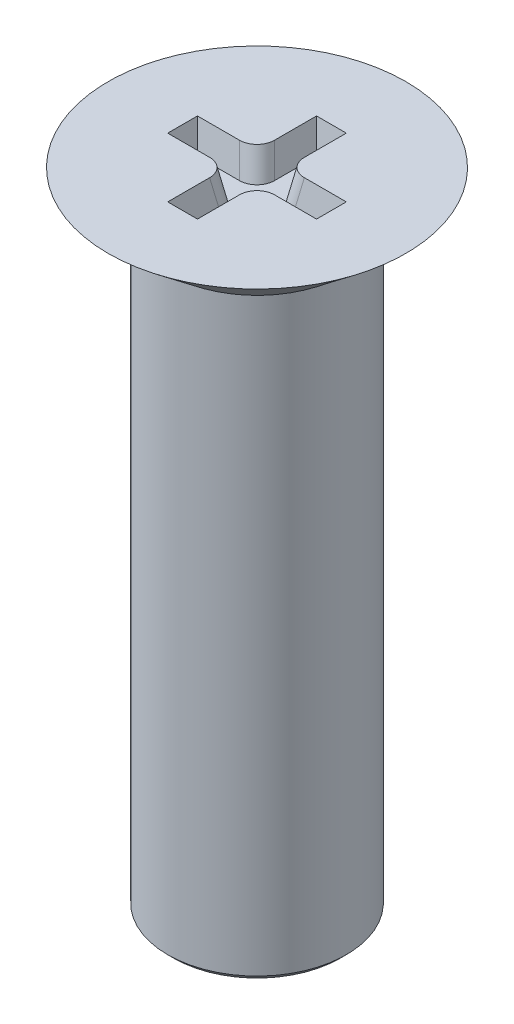
ISO-10303-21;
HEADER;
FILE_DESCRIPTION(('STEP AP214'),'2;1');
FILE_NAME('part.step','',(''),(''),'','','');
FILE_SCHEMA(('AUTOMOTIVE_DESIGN { 1 0 10303 214 1 1 1 1 }'));
ENDSEC;
DATA;
#1=APPLICATION_CONTEXT('core data for automotive mechanical design processes');
#2=APPLICATION_PROTOCOL_DEFINITION('international standard','automotive_design',2000,#1);
#3=PRODUCT_CONTEXT('',#1,'mechanical');
#4=PRODUCT('Part','Part','',(#3));
#5=PRODUCT_RELATED_PRODUCT_CATEGORY('part','',(#4));
#6=PRODUCT_DEFINITION_FORMATION('','',#4);
#7=PRODUCT_DEFINITION_CONTEXT('part definition',#1,'design');
#8=PRODUCT_DEFINITION('design','',#6,#7);
#9=PRODUCT_DEFINITION_SHAPE('','',#8);
#10=(LENGTH_UNIT() NAMED_UNIT(*) SI_UNIT(.MILLI.,.METRE.));
#11=(NAMED_UNIT(*) PLANE_ANGLE_UNIT() SI_UNIT($,.RADIAN.));
#12=(NAMED_UNIT(*) SI_UNIT($,.STERADIAN.) SOLID_ANGLE_UNIT());
#13=UNCERTAINTY_MEASURE_WITH_UNIT(LENGTH_MEASURE(1.E-05),#10,'distance_accuracy_value','');
#14=(GEOMETRIC_REPRESENTATION_CONTEXT(3) GLOBAL_UNCERTAINTY_ASSIGNED_CONTEXT((#13)) GLOBAL_UNIT_ASSIGNED_CONTEXT((#10,
#11,#12)) REPRESENTATION_CONTEXT('',''));
#15=CARTESIAN_POINT('',(0.,0.,0.));
#16=DIRECTION('',(0.,0.,1.));
#17=DIRECTION('',(1.,0.,0.));
#18=AXIS2_PLACEMENT_3D('',#15,#16,#17);
#19=CARTESIAN_POINT('',(0.,0.,0.));
#20=DIRECTION('',(0.,1.,0.));
#21=DIRECTION('',(0.,0.,1.));
#22=AXIS2_PLACEMENT_3D('',#19,#20,#21);
#23=PLANE('',#22);
#24=CARTESIAN_POINT('',(0.,0.,0.));
#25=DIRECTION('',(0.,-1.,0.));
#26=DIRECTION('',(0.,0.,-1.));
#27=AXIS2_PLACEMENT_3D('',#24,#25,#26);
#28=CIRCLE('',#27,2.5);
#29=CARTESIAN_POINT('',(0.,0.,-2.5));
#30=VERTEX_POINT('',#29);
#31=EDGE_CURVE('E254',#30,#30,#28,.T.);
#32=ORIENTED_EDGE('',*,*,#31,.F.);
#33=EDGE_LOOP('',(#32));
#34=FACE_BOUND('',#33,.T.);
#35=DIRECTION('',(1.,0.,0.));
#36=VECTOR('',#35,1.);
#37=CARTESIAN_POINT('',(0.,0.,-0.25));
#38=LINE('',#37,#36);
#39=CARTESIAN_POINT('',(-1.25,0.,-0.25));
#40=VERTEX_POINT('',#39);
#41=CARTESIAN_POINT('',(-0.545442325903662,0.,-0.25));
#42=VERTEX_POINT('',#41);
#43=EDGE_CURVE('E184',#40,#42,#38,.T.);
#44=ORIENTED_EDGE('',*,*,#43,.T.);
#45=CARTESIAN_POINT('',(-0.554627983565723,0.,-0.554627983565723));
#46=DIRECTION('',(0.,1.,0.));
#47=DIRECTION('',(-0.707106781186548,0.,-0.707106781186547));
#48=AXIS2_PLACEMENT_3D('',#45,#46,#47);
#49=ELLIPSE('',#48,0.309186702079241,0.3);
#50=CARTESIAN_POINT('',(-0.25,0.,-0.545442325903662));
#51=VERTEX_POINT('',#50);
#52=EDGE_CURVE('E272',#42,#51,#49,.T.);
#53=ORIENTED_EDGE('',*,*,#52,.T.);
#54=DIRECTION('',(0.,0.,1.));
#55=VECTOR('',#54,1.);
#56=CARTESIAN_POINT('',(-0.25,0.,0.));
#57=LINE('',#56,#55);
#58=CARTESIAN_POINT('',(-0.25,0.,-1.25));
#59=VERTEX_POINT('',#58);
#60=EDGE_CURVE('E182',#59,#51,#57,.T.);
#61=ORIENTED_EDGE('',*,*,#60,.F.);
#62=DIRECTION('',(1.,0.,0.));
#63=VECTOR('',#62,1.);
#64=CARTESIAN_POINT('',(0.,0.,-1.25));
#65=LINE('',#64,#63);
#66=CARTESIAN_POINT('',(0.25,0.,-1.25));
#67=VERTEX_POINT('',#66);
#68=EDGE_CURVE('E161',#59,#67,#65,.T.);
#69=ORIENTED_EDGE('',*,*,#68,.T.);
#70=DIRECTION('',(0.,0.,1.));
#71=VECTOR('',#70,1.);
#72=CARTESIAN_POINT('',(0.25,0.,0.));
#73=LINE('',#72,#71);
#74=CARTESIAN_POINT('',(0.25,0.,-0.545442325903662));
#75=VERTEX_POINT('',#74);
#76=EDGE_CURVE('E173',#67,#75,#73,.T.);
#77=ORIENTED_EDGE('',*,*,#76,.T.);
#78=CARTESIAN_POINT('',(0.554627983565724,0.,-0.554627983565723));
#79=DIRECTION('',(0.,1.,0.));
#80=DIRECTION('',(0.707106781186547,0.,-0.707106781186548));
#81=AXIS2_PLACEMENT_3D('',#78,#79,#80);
#82=ELLIPSE('',#81,0.309186702079241,0.3);
#83=CARTESIAN_POINT('',(0.545442325903663,0.,-0.25));
#84=VERTEX_POINT('',#83);
#85=EDGE_CURVE('E270',#75,#84,#82,.T.);
#86=ORIENTED_EDGE('',*,*,#85,.T.);
#87=DIRECTION('',(1.,0.,0.));
#88=VECTOR('',#87,1.);
#89=CARTESIAN_POINT('',(0.,0.,-0.25));
#90=LINE('',#89,#88);
#91=CARTESIAN_POINT('',(1.25,0.,-0.25));
#92=VERTEX_POINT('',#91);
#93=EDGE_CURVE('E178',#84,#92,#90,.T.);
#94=ORIENTED_EDGE('',*,*,#93,.T.);
#95=DIRECTION('',(0.,0.,-1.));
#96=VECTOR('',#95,1.);
#97=CARTESIAN_POINT('',(1.25,0.,0.));
#98=LINE('',#97,#96);
#99=CARTESIAN_POINT('',(1.25,0.,0.25));
#100=VERTEX_POINT('',#99);
#101=EDGE_CURVE('E204',#100,#92,#98,.T.);
#102=ORIENTED_EDGE('',*,*,#101,.F.);
#103=DIRECTION('',(1.,0.,0.));
#104=VECTOR('',#103,1.);
#105=CARTESIAN_POINT('',(0.,0.,0.25));
#106=LINE('',#105,#104);
#107=CARTESIAN_POINT('',(0.545442325903663,0.,0.25));
#108=VERTEX_POINT('',#107);
#109=EDGE_CURVE('E202',#108,#100,#106,.T.);
#110=ORIENTED_EDGE('',*,*,#109,.F.);
#111=CARTESIAN_POINT('',(0.554627983565724,0.,0.554627983565724));
#112=DIRECTION('',(0.,1.,0.));
#113=DIRECTION('',(0.707106781186548,0.,0.707106781186547));
#114=AXIS2_PLACEMENT_3D('',#111,#112,#113);
#115=ELLIPSE('',#114,0.309186702079241,0.3);
#116=CARTESIAN_POINT('',(0.25,0.,0.545442325903663));
#117=VERTEX_POINT('',#116);
#118=EDGE_CURVE('E266',#108,#117,#115,.T.);
#119=ORIENTED_EDGE('',*,*,#118,.T.);
#120=DIRECTION('',(0.,0.,1.));
#121=VECTOR('',#120,1.);
#122=CARTESIAN_POINT('',(0.25,0.,0.));
#123=LINE('',#122,#121);
#124=CARTESIAN_POINT('',(0.250000000000001,0.,1.25));
#125=VERTEX_POINT('',#124);
#126=EDGE_CURVE('E200',#117,#125,#123,.T.);
#127=ORIENTED_EDGE('',*,*,#126,.T.);
#128=DIRECTION('',(1.,0.,0.));
#129=VECTOR('',#128,1.);
#130=CARTESIAN_POINT('',(0.,0.,1.25));
#131=LINE('',#130,#129);
#132=CARTESIAN_POINT('',(-0.249999999999999,0.,1.25));
#133=VERTEX_POINT('',#132);
#134=EDGE_CURVE('E197',#133,#125,#131,.T.);
#135=ORIENTED_EDGE('',*,*,#134,.F.);
#136=DIRECTION('',(0.,0.,1.));
#137=VECTOR('',#136,1.);
#138=CARTESIAN_POINT('',(-0.25,0.,0.));
#139=LINE('',#138,#137);
#140=CARTESIAN_POINT('',(-0.25,0.,0.545442325903662));
#141=VERTEX_POINT('',#140);
#142=EDGE_CURVE('E195',#141,#133,#139,.T.);
#143=ORIENTED_EDGE('',*,*,#142,.F.);
#144=CARTESIAN_POINT('',(-0.554627983565723,0.,0.554627983565724));
#145=DIRECTION('',(0.,1.,0.));
#146=DIRECTION('',(-0.707106781186547,0.,0.707106781186548));
#147=AXIS2_PLACEMENT_3D('',#144,#145,#146);
#148=ELLIPSE('',#147,0.309186702079241,0.3);
#149=CARTESIAN_POINT('',(-0.545442325903662,0.,0.25));
#150=VERTEX_POINT('',#149);
#151=EDGE_CURVE('E268',#141,#150,#148,.T.);
#152=ORIENTED_EDGE('',*,*,#151,.T.);
#153=DIRECTION('',(1.,0.,0.));
#154=VECTOR('',#153,1.);
#155=CARTESIAN_POINT('',(0.,0.,0.25));
#156=LINE('',#155,#154);
#157=CARTESIAN_POINT('',(-1.25,0.,0.25));
#158=VERTEX_POINT('',#157);
#159=EDGE_CURVE('E192',#158,#150,#156,.T.);
#160=ORIENTED_EDGE('',*,*,#159,.F.);
#161=DIRECTION('',(0.,0.,-1.));
#162=VECTOR('',#161,1.);
#163=CARTESIAN_POINT('',(-1.25,0.,0.));
#164=LINE('',#163,#162);
#165=EDGE_CURVE('E189',#158,#40,#164,.T.);
#166=ORIENTED_EDGE('',*,*,#165,.T.);
#167=EDGE_LOOP('',(#44,#53,#61,#69,#77,#86,#94,#102,#110,#119,#127,#135,#143,#152,#160,#166));
#168=FACE_BOUND('',#167,.T.);
#169=ADVANCED_FACE('F45',(#34,#168),#23,.T.);
#170=CARTESIAN_POINT('',(0.,-0.8,0.));
#171=DIRECTION('',(0.,1.,0.));
#172=DIRECTION('',(0.,0.,1.));
#173=AXIS2_PLACEMENT_3D('',#170,#171,#172);
#174=CONICAL_SURFACE('',#173,1.5,0.896055384571344);
#175=ORIENTED_EDGE('',*,*,#31,.T.);
#176=EDGE_LOOP('',(#175));
#177=FACE_BOUND('',#176,.T.);
#178=CARTESIAN_POINT('',(0.,-0.8,0.));
#179=DIRECTION('',(0.,-1.,0.));
#180=DIRECTION('',(0.,0.,-1.));
#181=AXIS2_PLACEMENT_3D('',#178,#179,#180);
#182=CIRCLE('',#181,1.5);
#183=CARTESIAN_POINT('',(0.,-0.8,-1.5));
#184=VERTEX_POINT('',#183);
#185=EDGE_CURVE('E210',#184,#184,#182,.T.);
#186=ORIENTED_EDGE('',*,*,#185,.F.);
#187=EDGE_LOOP('',(#186));
#188=FACE_BOUND('',#187,.T.);
#189=ADVANCED_FACE('F349',(#177,#188),#174,.T.);
#190=CARTESIAN_POINT('',(0.,-10.8,0.));
#191=DIRECTION('',(0.,1.,0.));
#192=DIRECTION('',(0.,0.,1.));
#193=AXIS2_PLACEMENT_3D('',#190,#191,#192);
#194=CYLINDRICAL_SURFACE('',#193,1.5);
#195=CARTESIAN_POINT('',(0.,-10.7,0.));
#196=DIRECTION('',(0.,-1.,0.));
#197=DIRECTION('',(0.,0.,-1.));
#198=AXIS2_PLACEMENT_3D('',#195,#196,#197);
#199=CIRCLE('',#198,1.5);
#200=CARTESIAN_POINT('',(0.,-10.7,-1.5));
#201=VERTEX_POINT('',#200);
#202=EDGE_CURVE('E260',#201,#201,#199,.F.);
#203=ORIENTED_EDGE('',*,*,#202,.T.);
#204=EDGE_LOOP('',(#203));
#205=FACE_BOUND('',#204,.T.);
#206=ORIENTED_EDGE('',*,*,#185,.T.);
#207=EDGE_LOOP('',(#206));
#208=FACE_BOUND('',#207,.T.);
#209=ADVANCED_FACE('F357',(#205,#208),#194,.T.);
#210=CARTESIAN_POINT('',(0.,-10.8,0.));
#211=DIRECTION('',(0.,-1.,0.));
#212=DIRECTION('',(0.,0.,-1.));
#213=AXIS2_PLACEMENT_3D('',#210,#211,#212);
#214=PLANE('',#213);
#215=CARTESIAN_POINT('',(0.,-10.8,0.));
#216=DIRECTION('',(0.,-1.,0.));
#217=DIRECTION('',(0.,0.,-1.));
#218=AXIS2_PLACEMENT_3D('',#215,#216,#217);
#219=CIRCLE('',#218,1.4);
#220=CARTESIAN_POINT('',(0.,-10.8,-1.4));
#221=VERTEX_POINT('',#220);
#222=EDGE_CURVE('E257',#221,#221,#219,.T.);
#223=ORIENTED_EDGE('',*,*,#222,.T.);
#224=EDGE_LOOP('',(#223));
#225=FACE_BOUND('',#224,.T.);
#226=ADVANCED_FACE('F369',(#225),#214,.T.);
#227=CARTESIAN_POINT('',(0.,-10.8,0.));
#228=DIRECTION('',(0.,1.,0.));
#229=DIRECTION('',(0.,0.,1.));
#230=AXIS2_PLACEMENT_3D('',#227,#228,#229);
#231=CONICAL_SURFACE('',#230,1.4,0.785398163397435);
#232=ORIENTED_EDGE('',*,*,#202,.F.);
#233=EDGE_LOOP('',(#232));
#234=FACE_BOUND('',#233,.T.);
#235=ORIENTED_EDGE('',*,*,#222,.F.);
#236=EDGE_LOOP('',(#235));
#237=FACE_BOUND('',#236,.T.);
#238=ADVANCED_FACE('F364',(#234,#237),#231,.T.);
#239=CARTESIAN_POINT('',(0.,0.,-0.25));
#240=DIRECTION('',(0.,-0.17364817766693,-0.984807753012208));
#241=DIRECTION('',(0.,0.984807753012208,-0.17364817766693));
#242=AXIS2_PLACEMENT_3D('',#239,#240,#241);
#243=PLANE('',#242);
#244=ORIENTED_EDGE('',*,*,#93,.F.);
#245=DIRECTION('',(-0.171087869746036,-0.970287525247814,0.171087869746036));
#246=VECTOR('',#245,1.);
#247=CARTESIAN_POINT('',(0.529476651306003,-0.0905458400836372,-0.234034325402341));
#248=LINE('',#247,#246);
#249=CARTESIAN_POINT('',(0.45727883554943,-0.5,-0.161836509645767));
#250=VERTEX_POINT('',#249);
#251=EDGE_CURVE('E277',#84,#250,#248,.T.);
#252=ORIENTED_EDGE('',*,*,#251,.T.);
#253=DIRECTION('',(-1.,0.,0.));
#254=VECTOR('',#253,1.);
#255=CARTESIAN_POINT('',(0.,-0.5,-0.161836509645767));
#256=LINE('',#255,#254);
#257=CARTESIAN_POINT('',(1.16183650964577,-0.5,-0.161836509645767));
#258=VERTEX_POINT('',#257);
#259=EDGE_CURVE('E207',#250,#258,#256,.F.);
#260=ORIENTED_EDGE('',*,*,#259,.T.);
#261=DIRECTION('',(-0.171087869746036,-0.970287525247814,0.171087869746036));
#262=VECTOR('',#261,1.);
#263=CARTESIAN_POINT('',(1.2134111760322,-0.207505532169751,-0.213411176032204));
#264=LINE('',#263,#262);
#265=EDGE_CURVE('E208',#258,#92,#264,.F.);
#266=ORIENTED_EDGE('',*,*,#265,.T.);
#267=EDGE_LOOP('',(#244,#252,#260,#266));
#268=FACE_BOUND('',#267,.T.);
#269=ADVANCED_FACE('F333',(#268),#243,.F.);
#270=CARTESIAN_POINT('',(1.25,0.,0.));
#271=DIRECTION('',(0.984807753012208,-0.17364817766693,0.));
#272=DIRECTION('',(0.17364817766693,0.984807753012208,0.));
#273=AXIS2_PLACEMENT_3D('',#270,#271,#272);
#274=PLANE('',#273);
#275=ORIENTED_EDGE('',*,*,#101,.T.);
#276=ORIENTED_EDGE('',*,*,#265,.F.);
#277=DIRECTION('',(0.,0.,-1.));
#278=VECTOR('',#277,1.);
#279=CARTESIAN_POINT('',(1.16183650964577,-0.5,0.));
#280=LINE('',#279,#278);
#281=CARTESIAN_POINT('',(1.16183650964577,-0.5,0.161836509645768));
#282=VERTEX_POINT('',#281);
#283=EDGE_CURVE('E169',#282,#258,#280,.T.);
#284=ORIENTED_EDGE('',*,*,#283,.F.);
#285=DIRECTION('',(0.171087869746036,0.970287525247814,0.171087869746036));
#286=VECTOR('',#285,1.);
#287=CARTESIAN_POINT('',(1.2134111760322,-0.207505532169751,0.213411176032205));
#288=LINE('',#287,#286);
#289=EDGE_CURVE('E211',#282,#100,#288,.T.);
#290=ORIENTED_EDGE('',*,*,#289,.T.);
#291=EDGE_LOOP('',(#275,#276,#284,#290));
#292=FACE_BOUND('',#291,.T.);
#293=ADVANCED_FACE('F337',(#292),#274,.F.);
#294=CARTESIAN_POINT('',(0.,0.,0.25));
#295=DIRECTION('',(0.,-0.17364817766693,0.984807753012208));
#296=DIRECTION('',(0.,-0.984807753012208,-0.17364817766693));
#297=AXIS2_PLACEMENT_3D('',#294,#295,#296);
#298=PLANE('',#297);
#299=DIRECTION('',(1.,0.,0.));
#300=VECTOR('',#299,1.);
#301=CARTESIAN_POINT('',(0.,-0.5,0.161836509645768));
#302=LINE('',#301,#300);
#303=CARTESIAN_POINT('',(0.45727883554943,-0.5,0.161836509645768));
#304=VERTEX_POINT('',#303);
#305=EDGE_CURVE('E230',#304,#282,#302,.T.);
#306=ORIENTED_EDGE('',*,*,#305,.F.);
#307=DIRECTION('',(-0.171087869746036,-0.970287525247814,-0.171087869746036));
#308=VECTOR('',#307,1.);
#309=CARTESIAN_POINT('',(0.536794416099563,-0.049044733649687,0.2413520901959));
#310=LINE('',#309,#308);
#311=EDGE_CURVE('E284',#304,#108,#310,.F.);
#312=ORIENTED_EDGE('',*,*,#311,.T.);
#313=ORIENTED_EDGE('',*,*,#109,.T.);
#314=ORIENTED_EDGE('',*,*,#289,.F.);
#315=EDGE_LOOP('',(#306,#312,#313,#314));
#316=FACE_BOUND('',#315,.T.);
#317=ADVANCED_FACE('F341',(#316),#298,.F.);
#318=CARTESIAN_POINT('',(0.25,0.,0.));
#319=DIRECTION('',(0.984807753012208,-0.17364817766693,0.));
#320=DIRECTION('',(0.17364817766693,0.984807753012208,0.));
#321=AXIS2_PLACEMENT_3D('',#318,#319,#320);
#322=PLANE('',#321);
#323=ORIENTED_EDGE('',*,*,#126,.F.);
#324=DIRECTION('',(0.171087869746036,0.970287525247814,0.171087869746036));
#325=VECTOR('',#324,1.);
#326=CARTESIAN_POINT('',(0.153188599841668,-0.549044733649687,0.44863092574533));
#327=LINE('',#326,#325);
#328=CARTESIAN_POINT('',(0.161836509645768,-0.5,0.45727883554943));
#329=VERTEX_POINT('',#328);
#330=EDGE_CURVE('E60',#117,#329,#327,.F.);
#331=ORIENTED_EDGE('',*,*,#330,.T.);
#332=DIRECTION('',(0.,0.,-1.));
#333=VECTOR('',#332,1.);
#334=CARTESIAN_POINT('',(0.161836509645768,-0.5,0.));
#335=LINE('',#334,#333);
#336=CARTESIAN_POINT('',(0.161836509645768,-0.5,1.16183650964577));
#337=VERTEX_POINT('',#336);
#338=EDGE_CURVE('E232',#329,#337,#335,.F.);
#339=ORIENTED_EDGE('',*,*,#338,.T.);
#340=DIRECTION('',(-0.171087869746036,-0.970287525247814,-0.171087869746036));
#341=VECTOR('',#340,1.);
#342=CARTESIAN_POINT('',(0.213411176032205,-0.207505532169751,1.2134111760322));
#343=LINE('',#342,#341);
#344=EDGE_CURVE('E221',#337,#125,#343,.F.);
#345=ORIENTED_EDGE('',*,*,#344,.T.);
#346=EDGE_LOOP('',(#323,#331,#339,#345));
#347=FACE_BOUND('',#346,.T.);
#348=ADVANCED_FACE('F459',(#347),#322,.F.);
#349=CARTESIAN_POINT('',(0.,0.,1.25));
#350=DIRECTION('',(0.,-0.17364817766693,0.984807753012208));
#351=DIRECTION('',(0.,-0.984807753012208,-0.17364817766693));
#352=AXIS2_PLACEMENT_3D('',#349,#350,#351);
#353=PLANE('',#352);
#354=ORIENTED_EDGE('',*,*,#134,.T.);
#355=ORIENTED_EDGE('',*,*,#344,.F.);
#356=DIRECTION('',(1.,0.,0.));
#357=VECTOR('',#356,1.);
#358=CARTESIAN_POINT('',(0.,-0.5,1.16183650964577));
#359=LINE('',#358,#357);
#360=CARTESIAN_POINT('',(-0.161836509645767,-0.5,1.16183650964577));
#361=VERTEX_POINT('',#360);
#362=EDGE_CURVE('E234',#361,#337,#359,.T.);
#363=ORIENTED_EDGE('',*,*,#362,.F.);
#364=DIRECTION('',(-0.171087869746036,0.970287525247814,0.171087869746036));
#365=VECTOR('',#364,1.);
#366=CARTESIAN_POINT('',(-0.213411176032204,-0.207505532169751,1.2134111760322));
#367=LINE('',#366,#365);
#368=EDGE_CURVE('E218',#361,#133,#367,.T.);
#369=ORIENTED_EDGE('',*,*,#368,.T.);
#370=EDGE_LOOP('',(#354,#355,#363,#369));
#371=FACE_BOUND('',#370,.T.);
#372=ADVANCED_FACE('F451',(#371),#353,.F.);
#373=CARTESIAN_POINT('',(-0.25,0.,0.));
#374=DIRECTION('',(-0.984807753012208,-0.17364817766693,0.));
#375=DIRECTION('',(0.17364817766693,-0.984807753012208,0.));
#376=AXIS2_PLACEMENT_3D('',#373,#374,#375);
#377=PLANE('',#376);
#378=DIRECTION('',(0.,0.,1.));
#379=VECTOR('',#378,1.);
#380=CARTESIAN_POINT('',(-0.161836509645767,-0.5,0.));
#381=LINE('',#380,#379);
#382=CARTESIAN_POINT('',(-0.161836509645767,-0.5,0.45727883554943));
#383=VERTEX_POINT('',#382);
#384=EDGE_CURVE('E237',#383,#361,#381,.T.);
#385=ORIENTED_EDGE('',*,*,#384,.F.);
#386=DIRECTION('',(-0.171087869746036,0.970287525247814,0.171087869746036));
#387=VECTOR('',#386,1.);
#388=CARTESIAN_POINT('',(-0.23403432540234,-0.0905458400836372,0.529476651306003));
#389=LINE('',#388,#387);
#390=EDGE_CURVE('E279',#383,#141,#389,.T.);
#391=ORIENTED_EDGE('',*,*,#390,.T.);
#392=ORIENTED_EDGE('',*,*,#142,.T.);
#393=ORIENTED_EDGE('',*,*,#368,.F.);
#394=EDGE_LOOP('',(#385,#391,#392,#393));
#395=FACE_BOUND('',#394,.T.);
#396=ADVANCED_FACE('F302',(#395),#377,.F.);
#397=CARTESIAN_POINT('',(0.,0.,0.25));
#398=DIRECTION('',(0.,-0.17364817766693,0.984807753012208));
#399=DIRECTION('',(0.,-0.984807753012208,-0.17364817766693));
#400=AXIS2_PLACEMENT_3D('',#397,#398,#399);
#401=PLANE('',#400);
#402=ORIENTED_EDGE('',*,*,#159,.T.);
#403=DIRECTION('',(-0.171087869746036,0.970287525247814,0.171087869746036));
#404=VECTOR('',#403,1.);
#405=CARTESIAN_POINT('',(-0.529476651306003,-0.0905458400836371,0.234034325402341));
#406=LINE('',#405,#404);
#407=CARTESIAN_POINT('',(-0.457278835549429,-0.5,0.161836509645768));
#408=VERTEX_POINT('',#407);
#409=EDGE_CURVE('E282',#150,#408,#406,.F.);
#410=ORIENTED_EDGE('',*,*,#409,.T.);
#411=DIRECTION('',(1.,0.,0.));
#412=VECTOR('',#411,1.);
#413=CARTESIAN_POINT('',(0.,-0.5,0.161836509645768));
#414=LINE('',#413,#412);
#415=CARTESIAN_POINT('',(-1.16183650964577,-0.5,0.161836509645768));
#416=VERTEX_POINT('',#415);
#417=EDGE_CURVE('E239',#416,#408,#414,.T.);
#418=ORIENTED_EDGE('',*,*,#417,.F.);
#419=DIRECTION('',(0.171087869746036,-0.970287525247814,-0.171087869746036));
#420=VECTOR('',#419,1.);
#421=CARTESIAN_POINT('',(-1.2134111760322,-0.207505532169751,0.213411176032205));
#422=LINE('',#421,#420);
#423=EDGE_CURVE('E216',#416,#158,#422,.F.);
#424=ORIENTED_EDGE('',*,*,#423,.T.);
#425=EDGE_LOOP('',(#402,#410,#418,#424));
#426=FACE_BOUND('',#425,.T.);
#427=ADVANCED_FACE('F309',(#426),#401,.F.);
#428=CARTESIAN_POINT('',(-1.25,0.,0.));
#429=DIRECTION('',(-0.984807753012208,-0.17364817766693,0.));
#430=DIRECTION('',(0.17364817766693,-0.984807753012208,0.));
#431=AXIS2_PLACEMENT_3D('',#428,#429,#430);
#432=PLANE('',#431);
#433=ORIENTED_EDGE('',*,*,#165,.F.);
#434=ORIENTED_EDGE('',*,*,#423,.F.);
#435=DIRECTION('',(0.,0.,1.));
#436=VECTOR('',#435,1.);
#437=CARTESIAN_POINT('',(-1.16183650964577,-0.5,0.));
#438=LINE('',#437,#436);
#439=CARTESIAN_POINT('',(-1.16183650964577,-0.5,-0.161836509645767));
#440=VERTEX_POINT('',#439);
#441=EDGE_CURVE('E242',#416,#440,#438,.F.);
#442=ORIENTED_EDGE('',*,*,#441,.T.);
#443=DIRECTION('',(-0.171087869746036,0.970287525247814,-0.171087869746036));
#444=VECTOR('',#443,1.);
#445=CARTESIAN_POINT('',(-1.2134111760322,-0.207505532169751,-0.213411176032204));
#446=LINE('',#445,#444);
#447=EDGE_CURVE('E214',#440,#40,#446,.T.);
#448=ORIENTED_EDGE('',*,*,#447,.T.);
#449=EDGE_LOOP('',(#433,#434,#442,#448));
#450=FACE_BOUND('',#449,.T.);
#451=ADVANCED_FACE('F312',(#450),#432,.F.);
#452=CARTESIAN_POINT('',(0.,0.,-0.25));
#453=DIRECTION('',(0.,-0.17364817766693,-0.984807753012208));
#454=DIRECTION('',(0.,0.984807753012208,-0.17364817766693));
#455=AXIS2_PLACEMENT_3D('',#452,#453,#454);
#456=PLANE('',#455);
#457=DIRECTION('',(-1.,0.,0.));
#458=VECTOR('',#457,1.);
#459=CARTESIAN_POINT('',(0.,-0.5,-0.161836509645767));
#460=LINE('',#459,#458);
#461=CARTESIAN_POINT('',(-0.457278835549429,-0.5,-0.161836509645767));
#462=VERTEX_POINT('',#461);
#463=EDGE_CURVE('E244',#440,#462,#460,.F.);
#464=ORIENTED_EDGE('',*,*,#463,.T.);
#465=DIRECTION('',(-0.171087869746036,0.970287525247814,-0.171087869746036));
#466=VECTOR('',#465,1.);
#467=CARTESIAN_POINT('',(-0.536794416099562,-0.0490447336496869,-0.2413520901959));
#468=LINE('',#467,#466);
#469=EDGE_CURVE('E263',#462,#42,#468,.T.);
#470=ORIENTED_EDGE('',*,*,#469,.T.);
#471=ORIENTED_EDGE('',*,*,#43,.F.);
#472=ORIENTED_EDGE('',*,*,#447,.F.);
#473=EDGE_LOOP('',(#464,#470,#471,#472));
#474=FACE_BOUND('',#473,.T.);
#475=ADVANCED_FACE('F316',(#474),#456,.F.);
#476=CARTESIAN_POINT('',(-0.25,0.,0.));
#477=DIRECTION('',(-0.984807753012208,-0.17364817766693,0.));
#478=DIRECTION('',(0.17364817766693,-0.984807753012208,0.));
#479=AXIS2_PLACEMENT_3D('',#476,#477,#478);
#480=PLANE('',#479);
#481=ORIENTED_EDGE('',*,*,#60,.T.);
#482=DIRECTION('',(0.171087869746036,-0.970287525247814,0.171087869746036));
#483=VECTOR('',#482,1.);
#484=CARTESIAN_POINT('',(-0.153188599841667,-0.549044733649687,-0.44863092574533));
#485=LINE('',#484,#483);
#486=CARTESIAN_POINT('',(-0.161836509645767,-0.5,-0.45727883554943));
#487=VERTEX_POINT('',#486);
#488=EDGE_CURVE('E274',#51,#487,#485,.T.);
#489=ORIENTED_EDGE('',*,*,#488,.T.);
#490=DIRECTION('',(0.,0.,1.));
#491=VECTOR('',#490,1.);
#492=CARTESIAN_POINT('',(-0.161836509645767,-0.5,0.));
#493=LINE('',#492,#491);
#494=CARTESIAN_POINT('',(-0.161836509645767,-0.5,-1.16183650964577));
#495=VERTEX_POINT('',#494);
#496=EDGE_CURVE('E247',#495,#487,#493,.T.);
#497=ORIENTED_EDGE('',*,*,#496,.F.);
#498=DIRECTION('',(0.171087869746036,-0.970287525247814,0.171087869746036));
#499=VECTOR('',#498,1.);
#500=CARTESIAN_POINT('',(-0.213411176032204,-0.207505532169751,-1.2134111760322));
#501=LINE('',#500,#499);
#502=EDGE_CURVE('E168',#495,#59,#501,.F.);
#503=ORIENTED_EDGE('',*,*,#502,.T.);
#504=EDGE_LOOP('',(#481,#489,#497,#503));
#505=FACE_BOUND('',#504,.T.);
#506=ADVANCED_FACE('F325',(#505),#480,.F.);
#507=CARTESIAN_POINT('',(0.,0.,-1.25));
#508=DIRECTION('',(0.,-0.17364817766693,-0.984807753012208));
#509=DIRECTION('',(0.,0.984807753012208,-0.17364817766693));
#510=AXIS2_PLACEMENT_3D('',#507,#508,#509);
#511=PLANE('',#510);
#512=ORIENTED_EDGE('',*,*,#68,.F.);
#513=ORIENTED_EDGE('',*,*,#502,.F.);
#514=DIRECTION('',(-1.,0.,0.));
#515=VECTOR('',#514,1.);
#516=CARTESIAN_POINT('',(0.,-0.5,-1.16183650964577));
#517=LINE('',#516,#515);
#518=CARTESIAN_POINT('',(0.161836509645768,-0.5,-1.16183650964577));
#519=VERTEX_POINT('',#518);
#520=EDGE_CURVE('E164',#495,#519,#517,.F.);
#521=ORIENTED_EDGE('',*,*,#520,.T.);
#522=DIRECTION('',(0.171087869746036,0.970287525247814,-0.171087869746036));
#523=VECTOR('',#522,1.);
#524=CARTESIAN_POINT('',(0.213411176032205,-0.207505532169751,-1.2134111760322));
#525=LINE('',#524,#523);
#526=EDGE_CURVE('E157',#519,#67,#525,.T.);
#527=ORIENTED_EDGE('',*,*,#526,.T.);
#528=EDGE_LOOP('',(#512,#513,#521,#527));
#529=FACE_BOUND('',#528,.T.);
#530=ADVANCED_FACE('F159',(#529),#511,.F.);
#531=CARTESIAN_POINT('',(0.25,0.,0.));
#532=DIRECTION('',(0.984807753012208,-0.17364817766693,0.));
#533=DIRECTION('',(0.17364817766693,0.984807753012208,0.));
#534=AXIS2_PLACEMENT_3D('',#531,#532,#533);
#535=PLANE('',#534);
#536=DIRECTION('',(0.,0.,-1.));
#537=VECTOR('',#536,1.);
#538=CARTESIAN_POINT('',(0.161836509645768,-0.5,0.));
#539=LINE('',#538,#537);
#540=CARTESIAN_POINT('',(0.161836509645768,-0.5,-0.45727883554943));
#541=VERTEX_POINT('',#540);
#542=EDGE_CURVE('E227',#519,#541,#539,.F.);
#543=ORIENTED_EDGE('',*,*,#542,.T.);
#544=DIRECTION('',(-0.171087869746036,-0.970287525247814,0.171087869746036));
#545=VECTOR('',#544,1.);
#546=CARTESIAN_POINT('',(0.234034325402341,-0.0905458400836371,-0.529476651306003));
#547=LINE('',#546,#545);
#548=EDGE_CURVE('E176',#541,#75,#547,.F.);
#549=ORIENTED_EDGE('',*,*,#548,.T.);
#550=ORIENTED_EDGE('',*,*,#76,.F.);
#551=ORIENTED_EDGE('',*,*,#526,.F.);
#552=EDGE_LOOP('',(#543,#549,#550,#551));
#553=FACE_BOUND('',#552,.T.);
#554=ADVANCED_FACE('F174',(#553),#535,.F.);
#555=CARTESIAN_POINT('',(0.,-0.5,0.));
#556=DIRECTION('',(0.,1.,0.));
#557=DIRECTION('',(0.,0.,1.));
#558=AXIS2_PLACEMENT_3D('',#555,#556,#557);
#559=PLANE('',#558);
#560=ORIENTED_EDGE('',*,*,#259,.F.);
#561=CARTESIAN_POINT('',(0.466464493211491,-0.5,-0.466464493211491));
#562=DIRECTION('',(0.,1.,0.));
#563=DIRECTION('',(0.707106781186547,0.,-0.707106781186548));
#564=AXIS2_PLACEMENT_3D('',#561,#562,#563);
#565=ELLIPSE('',#564,0.309186702079241,0.3);
#566=EDGE_CURVE('E290',#250,#541,#565,.F.);
#567=ORIENTED_EDGE('',*,*,#566,.T.);
#568=ORIENTED_EDGE('',*,*,#542,.F.);
#569=ORIENTED_EDGE('',*,*,#520,.F.);
#570=ORIENTED_EDGE('',*,*,#496,.T.);
#571=CARTESIAN_POINT('',(-0.466464493211491,-0.5,-0.466464493211491));
#572=DIRECTION('',(0.,1.,0.));
#573=DIRECTION('',(-0.707106781186548,0.,-0.707106781186547));
#574=AXIS2_PLACEMENT_3D('',#571,#572,#573);
#575=ELLIPSE('',#574,0.309186702079241,0.3);
#576=EDGE_CURVE('E288',#487,#462,#575,.F.);
#577=ORIENTED_EDGE('',*,*,#576,.T.);
#578=ORIENTED_EDGE('',*,*,#463,.F.);
#579=ORIENTED_EDGE('',*,*,#441,.F.);
#580=ORIENTED_EDGE('',*,*,#417,.T.);
#581=CARTESIAN_POINT('',(-0.46646449321149,-0.5,0.466464493211491));
#582=DIRECTION('',(0.,1.,0.));
#583=DIRECTION('',(-0.707106781186547,0.,0.707106781186548));
#584=AXIS2_PLACEMENT_3D('',#581,#582,#583);
#585=ELLIPSE('',#584,0.309186702079241,0.3);
#586=EDGE_CURVE('E53',#408,#383,#585,.F.);
#587=ORIENTED_EDGE('',*,*,#586,.T.);
#588=ORIENTED_EDGE('',*,*,#384,.T.);
#589=ORIENTED_EDGE('',*,*,#362,.T.);
#590=ORIENTED_EDGE('',*,*,#338,.F.);
#591=CARTESIAN_POINT('',(0.466464493211491,-0.5,0.466464493211491));
#592=DIRECTION('',(0.,1.,0.));
#593=DIRECTION('',(0.707106781186548,0.,0.707106781186547));
#594=AXIS2_PLACEMENT_3D('',#591,#592,#593);
#595=ELLIPSE('',#594,0.309186702079241,0.3);
#596=EDGE_CURVE('E11',#329,#304,#595,.F.);
#597=ORIENTED_EDGE('',*,*,#596,.T.);
#598=ORIENTED_EDGE('',*,*,#305,.T.);
#599=ORIENTED_EDGE('',*,*,#283,.T.);
#600=EDGE_LOOP('',(#560,#567,#568,#569,#570,#577,#578,#579,#580,#587,#588,#589,#590,#597,#598,#599));
#601=FACE_BOUND('',#600,.T.);
#602=ADVANCED_FACE('F294',(#601),#559,.T.);
#603=CARTESIAN_POINT('',(-0.529476651306003,-0.142640293383716,-0.529476651306003));
#604=DIRECTION('',(-0.171087869746036,0.970287525247814,-0.171087869746036));
#605=DIRECTION('',(-0.984807753012208,-0.17364817766693,0.));
#606=AXIS2_PLACEMENT_3D('',#603,#604,#605);
#607=CYLINDRICAL_SURFACE('',#606,0.3);
#608=ORIENTED_EDGE('',*,*,#576,.F.);
#609=ORIENTED_EDGE('',*,*,#488,.F.);
#610=ORIENTED_EDGE('',*,*,#52,.F.);
#611=ORIENTED_EDGE('',*,*,#469,.F.);
#612=EDGE_LOOP('',(#608,#609,#610,#611));
#613=FACE_BOUND('',#612,.T.);
#614=ADVANCED_FACE('F321',(#613),#607,.T.);
#615=CARTESIAN_POINT('',(0.529476651306003,-0.142640293383716,-0.529476651306003));
#616=DIRECTION('',(0.171087869746036,0.970287525247814,-0.171087869746036));
#617=DIRECTION('',(0.,0.17364817766693,0.984807753012208));
#618=AXIS2_PLACEMENT_3D('',#615,#616,#617);
#619=CYLINDRICAL_SURFACE('',#618,0.3);
#620=ORIENTED_EDGE('',*,*,#566,.F.);
#621=ORIENTED_EDGE('',*,*,#251,.F.);
#622=ORIENTED_EDGE('',*,*,#85,.F.);
#623=ORIENTED_EDGE('',*,*,#548,.F.);
#624=EDGE_LOOP('',(#620,#621,#622,#623));
#625=FACE_BOUND('',#624,.T.);
#626=ADVANCED_FACE('F328',(#625),#619,.T.);
#627=CARTESIAN_POINT('',(-0.529476651306003,-0.142640293383716,0.529476651306003));
#628=DIRECTION('',(-0.171087869746036,0.970287525247814,0.171087869746036));
#629=DIRECTION('',(0.,-0.17364817766693,0.984807753012208));
#630=AXIS2_PLACEMENT_3D('',#627,#628,#629);
#631=CYLINDRICAL_SURFACE('',#630,0.3);
#632=ORIENTED_EDGE('',*,*,#586,.F.);
#633=ORIENTED_EDGE('',*,*,#409,.F.);
#634=ORIENTED_EDGE('',*,*,#151,.F.);
#635=ORIENTED_EDGE('',*,*,#390,.F.);
#636=EDGE_LOOP('',(#632,#633,#634,#635));
#637=FACE_BOUND('',#636,.T.);
#638=ADVANCED_FACE('F305',(#637),#631,.T.);
#639=CARTESIAN_POINT('',(0.529476651306004,-0.142640293383716,0.529476651306003));
#640=DIRECTION('',(0.171087869746036,0.970287525247814,0.171087869746036));
#641=DIRECTION('',(-0.984807753012208,0.17364817766693,0.));
#642=AXIS2_PLACEMENT_3D('',#639,#640,#641);
#643=CYLINDRICAL_SURFACE('',#642,0.3);
#644=ORIENTED_EDGE('',*,*,#596,.F.);
#645=ORIENTED_EDGE('',*,*,#330,.F.);
#646=ORIENTED_EDGE('',*,*,#118,.F.);
#647=ORIENTED_EDGE('',*,*,#311,.F.);
#648=EDGE_LOOP('',(#644,#645,#646,#647));
#649=FACE_BOUND('',#648,.T.);
#650=ADVANCED_FACE('F47',(#649),#643,.T.);
#651=CLOSED_SHELL('',(#169,#189,#209,#226,#238,#269,#293,#317,#348,#372,#396,#427,#451,#475,
#506,#530,#554,#602,#614,#626,#638,#650));
#652=MANIFOLD_SOLID_BREP('B2',#651);
#653=ADVANCED_BREP_SHAPE_REPRESENTATION('',(#18,#652),#14);
#654=SHAPE_DEFINITION_REPRESENTATION(#9,#653);
ENDSEC;
END-ISO-10303-21;
